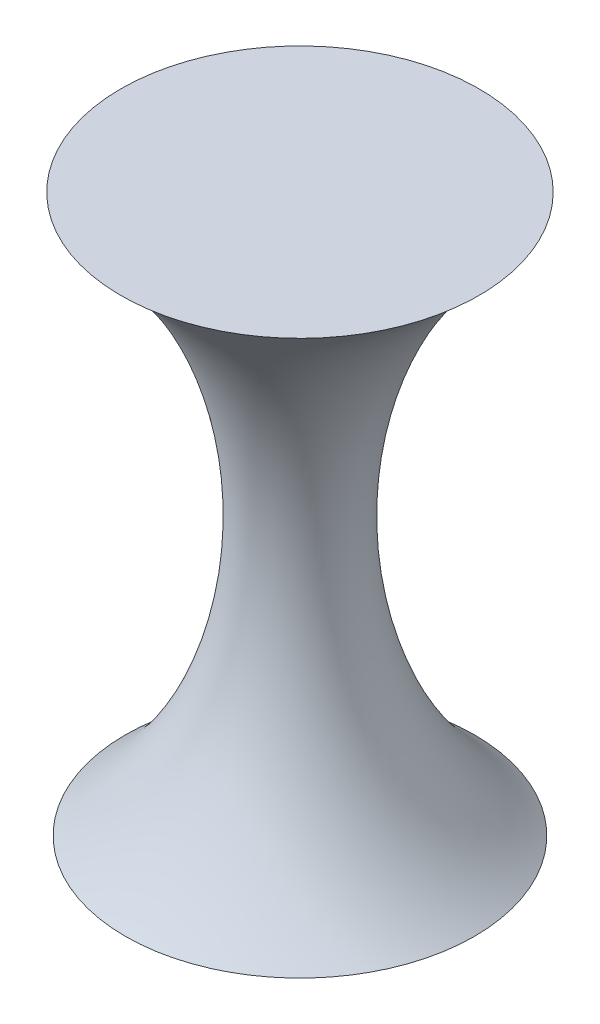
ISO-10303-21;
HEADER;
FILE_DESCRIPTION(('STEP AP214'),'2;1');
FILE_NAME('part.step','',(''),(''),'','','');
FILE_SCHEMA(('AUTOMOTIVE_DESIGN { 1 0 10303 214 1 1 1 1 }'));
ENDSEC;
DATA;
#1=APPLICATION_CONTEXT('core data for automotive mechanical design processes');
#2=APPLICATION_PROTOCOL_DEFINITION('international standard','automotive_design',2000,#1);
#3=PRODUCT_CONTEXT('',#1,'mechanical');
#4=PRODUCT('Part','Part','',(#3));
#5=PRODUCT_RELATED_PRODUCT_CATEGORY('part','',(#4));
#6=PRODUCT_DEFINITION_FORMATION('','',#4);
#7=PRODUCT_DEFINITION_CONTEXT('part definition',#1,'design');
#8=PRODUCT_DEFINITION('design','',#6,#7);
#9=PRODUCT_DEFINITION_SHAPE('','',#8);
#10=(LENGTH_UNIT() NAMED_UNIT(*) SI_UNIT(.MILLI.,.METRE.));
#11=(NAMED_UNIT(*) PLANE_ANGLE_UNIT() SI_UNIT($,.RADIAN.));
#12=(NAMED_UNIT(*) SI_UNIT($,.STERADIAN.) SOLID_ANGLE_UNIT());
#13=UNCERTAINTY_MEASURE_WITH_UNIT(LENGTH_MEASURE(1.E-05),#10,'distance_accuracy_value','');
#14=(GEOMETRIC_REPRESENTATION_CONTEXT(3) GLOBAL_UNCERTAINTY_ASSIGNED_CONTEXT((#13)) GLOBAL_UNIT_ASSIGNED_CONTEXT((#10,
#11,#12)) REPRESENTATION_CONTEXT('',''));
#15=CARTESIAN_POINT('',(0.,0.,0.));
#16=DIRECTION('',(0.,0.,1.));
#17=DIRECTION('',(1.,0.,0.));
#18=AXIS2_PLACEMENT_3D('',#15,#16,#17);
#19=CARTESIAN_POINT('',(-82.3439254909115,-0.470891146450277,0.));
#20=DIRECTION('',(0.,0.,1.));
#21=DIRECTION('',(0.,1.,0.));
#22=AXIS2_PLACEMENT_3D('',#19,#20,#21);
#23=ELLIPSE('',#22,89.0902875462202,67.2503225503647);
#24=CARTESIAN_POINT('',(0.,80.8479532163743,0.));
#25=DIRECTION('',(0.,1.,0.));
#26=AXIS1_PLACEMENT('',#24,#25);
#27=SURFACE_OF_REVOLUTION('',#23,#26);
#28=CARTESIAN_POINT('',(0.,77.5,0.));
#29=DIRECTION('',(0.,1.,0.));
#30=DIRECTION('',(-1.,0.,0.));
#31=AXIS2_PLACEMENT_3D('',#28,#29,#30);
#32=CIRCLE('',#31,49.8095564922682);
#33=CARTESIAN_POINT('',(-49.8095564922682,77.5,0.));
#34=VERTEX_POINT('',#33);
#35=EDGE_CURVE('E37',#34,#34,#32,.T.);
#36=ORIENTED_EDGE('',*,*,#35,.F.);
#37=EDGE_LOOP('',(#36));
#38=FACE_BOUND('',#37,.T.);
#39=CARTESIAN_POINT('',(0.,-77.5,0.));
#40=DIRECTION('',(0.,1.,0.));
#41=DIRECTION('',(-1.,0.,0.));
#42=AXIS2_PLACEMENT_3D('',#39,#40,#41);
#43=CIRCLE('',#42,48.5554140614493);
#44=CARTESIAN_POINT('',(-48.5554140614493,-77.5000000000001,0.));
#45=VERTEX_POINT('',#44);
#46=EDGE_CURVE('E10',#45,#45,#43,.T.);
#47=ORIENTED_EDGE('',*,*,#46,.T.);
#48=EDGE_LOOP('',(#47));
#49=FACE_BOUND('',#48,.T.);
#50=ADVANCED_FACE('F30',(#38,#49),#27,.T.);
#51=CARTESIAN_POINT('',(0.,-77.5,0.));
#52=DIRECTION('',(0.,-1.,0.));
#53=DIRECTION('',(1.,0.,0.));
#54=AXIS2_PLACEMENT_3D('',#51,#52,#53);
#55=PLANE('',#54);
#56=ORIENTED_EDGE('',*,*,#46,.F.);
#57=EDGE_LOOP('',(#56));
#58=FACE_BOUND('',#57,.T.);
#59=ADVANCED_FACE('F47',(#58),#55,.T.);
#60=CARTESIAN_POINT('',(0.,77.5,0.));
#61=DIRECTION('',(0.,1.,0.));
#62=DIRECTION('',(-1.,0.,0.));
#63=AXIS2_PLACEMENT_3D('',#60,#61,#62);
#64=PLANE('',#63);
#65=ORIENTED_EDGE('',*,*,#35,.T.);
#66=EDGE_LOOP('',(#65));
#67=FACE_BOUND('',#66,.T.);
#68=ADVANCED_FACE('F44',(#67),#64,.T.);
#69=CLOSED_SHELL('',(#50,#59,#68));
#70=MANIFOLD_SOLID_BREP('B2',#69);
#71=ADVANCED_BREP_SHAPE_REPRESENTATION('',(#18,#70),#14);
#72=SHAPE_DEFINITION_REPRESENTATION(#9,#71);
ENDSEC;
END-ISO-10303-21;
